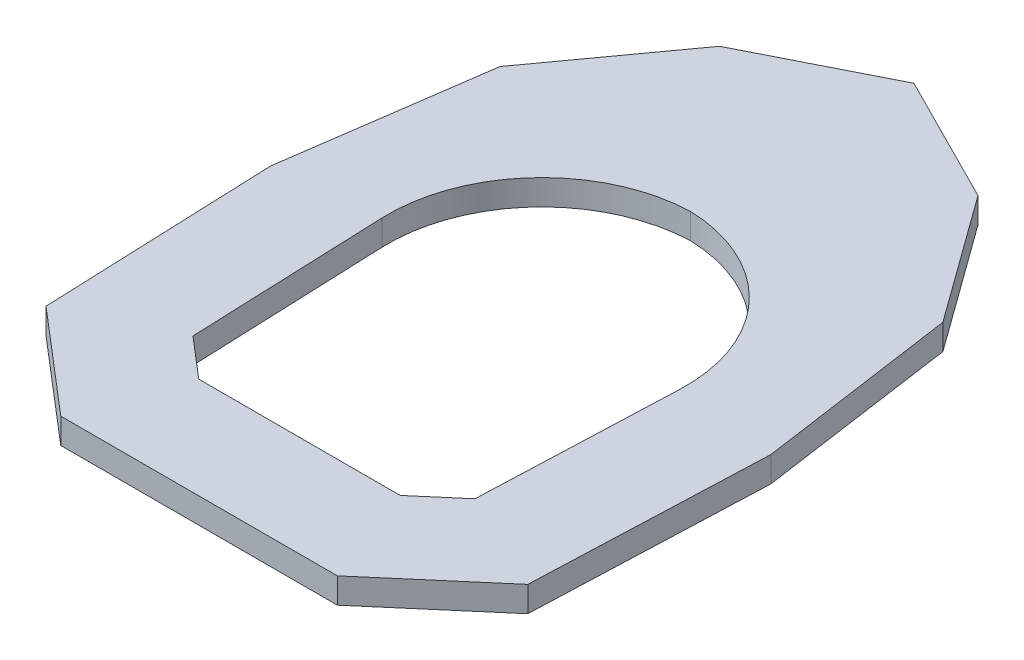
ISO-10303-21;
HEADER;
FILE_DESCRIPTION(('STEP AP214'),'2;1');
FILE_NAME('part.step','',(''),(''),'','','');
FILE_SCHEMA(('AUTOMOTIVE_DESIGN { 1 0 10303 214 1 1 1 1 }'));
ENDSEC;
DATA;
#1=APPLICATION_CONTEXT('core data for automotive mechanical design processes');
#2=APPLICATION_PROTOCOL_DEFINITION('international standard','automotive_design',2000,#1);
#3=PRODUCT_CONTEXT('',#1,'mechanical');
#4=PRODUCT('Part','Part','',(#3));
#5=PRODUCT_RELATED_PRODUCT_CATEGORY('part','',(#4));
#6=PRODUCT_DEFINITION_FORMATION('','',#4);
#7=PRODUCT_DEFINITION_CONTEXT('part definition',#1,'design');
#8=PRODUCT_DEFINITION('design','',#6,#7);
#9=PRODUCT_DEFINITION_SHAPE('','',#8);
#10=(LENGTH_UNIT() NAMED_UNIT(*) SI_UNIT(.MILLI.,.METRE.));
#11=(NAMED_UNIT(*) PLANE_ANGLE_UNIT() SI_UNIT($,.RADIAN.));
#12=(NAMED_UNIT(*) SI_UNIT($,.STERADIAN.) SOLID_ANGLE_UNIT());
#13=UNCERTAINTY_MEASURE_WITH_UNIT(LENGTH_MEASURE(1.E-05),#10,'distance_accuracy_value','');
#14=(GEOMETRIC_REPRESENTATION_CONTEXT(3) GLOBAL_UNCERTAINTY_ASSIGNED_CONTEXT((#13)) GLOBAL_UNIT_ASSIGNED_CONTEXT((#10,
#11,#12)) REPRESENTATION_CONTEXT('',''));
#15=CARTESIAN_POINT('',(0.,0.,0.));
#16=DIRECTION('',(0.,0.,1.));
#17=DIRECTION('',(1.,0.,0.));
#18=AXIS2_PLACEMENT_3D('',#15,#16,#17);
#19=CARTESIAN_POINT('',(9.9772531070188,-50.,31.4077449235651));
#20=DIRECTION('',(0.,1.,0.));
#21=DIRECTION('',(0.,0.,1.));
#22=AXIS2_PLACEMENT_3D('',#19,#20,#21);
#23=CYLINDRICAL_SURFACE('',#22,302.631122632561);
#24=CARTESIAN_POINT('',(9.9772531070188,0.,31.4077449235651));
#25=DIRECTION('',(0.,1.,0.));
#26=DIRECTION('',(0.,0.,1.));
#27=AXIS2_PLACEMENT_3D('',#24,#25,#26);
#28=CIRCLE('',#27,302.631122632561);
#29=CARTESIAN_POINT('',(-8.81239525796218E-13,0.,-271.058866136702));
#30=VERTEX_POINT('',#29);
#31=CARTESIAN_POINT('',(-292.423977969538,0.,43.2014648298256));
#32=VERTEX_POINT('',#31);
#33=EDGE_CURVE('E249',#30,#32,#28,.T.);
#34=ORIENTED_EDGE('',*,*,#33,.T.);
#35=DIRECTION('',(0.,1.,0.));
#36=VECTOR('',#35,1.);
#37=CARTESIAN_POINT('',(-292.423977969538,-50.,43.2014648298256));
#38=LINE('',#37,#36);
#39=CARTESIAN_POINT('',(-292.423977969538,-50.,43.2014648298256));
#40=VERTEX_POINT('',#39);
#41=EDGE_CURVE('E11',#40,#32,#38,.T.);
#42=ORIENTED_EDGE('',*,*,#41,.F.);
#43=CARTESIAN_POINT('',(9.9772531070188,-50.,31.4077449235651));
#44=DIRECTION('',(0.,1.,0.));
#45=DIRECTION('',(0.,0.,1.));
#46=AXIS2_PLACEMENT_3D('',#43,#44,#45);
#47=CIRCLE('',#46,302.631122632561);
#48=CARTESIAN_POINT('',(-8.81239525796218E-13,-50.,-271.058866136702));
#49=VERTEX_POINT('',#48);
#50=EDGE_CURVE('E65',#49,#40,#47,.T.);
#51=ORIENTED_EDGE('',*,*,#50,.F.);
#52=DIRECTION('',(0.,1.,0.));
#53=VECTOR('',#52,1.);
#54=CARTESIAN_POINT('',(-8.81239525796218E-13,-50.,-271.058866136702));
#55=LINE('',#54,#53);
#56=EDGE_CURVE('E284',#49,#30,#55,.T.);
#57=ORIENTED_EDGE('',*,*,#56,.T.);
#58=EDGE_LOOP('',(#34,#42,#51,#57));
#59=FACE_BOUND('',#58,.T.);
#60=ADVANCED_FACE('F45',(#59),#23,.F.);
#61=CARTESIAN_POINT('',(-293.662179747709,-50.,11.4528948267728));
#62=DIRECTION('',(0.999240357191274,0.,-0.0389706114945085));
#63=DIRECTION('',(-0.0389706114945085,0.,-0.999240357191274));
#64=AXIS2_PLACEMENT_3D('',#61,#62,#63);
#65=PLANE('',#64);
#66=DIRECTION('',(-0.0389706114945085,0.,-0.999240357191274));
#67=VECTOR('',#66,1.);
#68=CARTESIAN_POINT('',(-293.662179747709,0.,11.4528948267728));
#69=LINE('',#68,#67);
#70=CARTESIAN_POINT('',(-277.326571574198,0.,430.312089492883));
#71=VERTEX_POINT('',#70);
#72=EDGE_CURVE('E268',#71,#32,#69,.T.);
#73=ORIENTED_EDGE('',*,*,#72,.F.);
#74=DIRECTION('',(0.,1.,0.));
#75=VECTOR('',#74,1.);
#76=CARTESIAN_POINT('',(-277.326571574198,-50.,430.312089492883));
#77=LINE('',#76,#75);
#78=CARTESIAN_POINT('',(-277.326571574198,-50.,430.312089492883));
#79=VERTEX_POINT('',#78);
#80=EDGE_CURVE('E56',#79,#71,#77,.T.);
#81=ORIENTED_EDGE('',*,*,#80,.F.);
#82=DIRECTION('',(-0.0389706114945085,0.,-0.999240357191274));
#83=VECTOR('',#82,1.);
#84=CARTESIAN_POINT('',(-293.662179747709,-50.,11.4528948267728));
#85=LINE('',#84,#83);
#86=EDGE_CURVE('E194',#79,#40,#85,.T.);
#87=ORIENTED_EDGE('',*,*,#86,.T.);
#88=ORIENTED_EDGE('',*,*,#41,.T.);
#89=EDGE_LOOP('',(#73,#81,#87,#88));
#90=FACE_BOUND('',#89,.T.);
#91=ADVANCED_FACE('F392',(#90),#65,.T.);
#92=CARTESIAN_POINT('',(-329.839629485281,-50.,385.365433519217));
#93=DIRECTION('',(0.65025298021813,0.,-0.75971775135075));
#94=DIRECTION('',(-0.75971775135075,0.,-0.65025298021813));
#95=AXIS2_PLACEMENT_3D('',#92,#93,#94);
#96=PLANE('',#95);
#97=DIRECTION('',(-0.75971775135075,0.,-0.65025298021813));
#98=VECTOR('',#97,1.);
#99=CARTESIAN_POINT('',(-329.839629485281,0.,385.365433519217));
#100=LINE('',#99,#98);
#101=CARTESIAN_POINT('',(-198.047881984539,0.,498.167821548384));
#102=VERTEX_POINT('',#101);
#103=EDGE_CURVE('E183',#102,#71,#100,.T.);
#104=ORIENTED_EDGE('',*,*,#103,.F.);
#105=DIRECTION('',(0.,1.,0.));
#106=VECTOR('',#105,1.);
#107=CARTESIAN_POINT('',(-198.047881984539,-50.,498.167821548384));
#108=LINE('',#107,#106);
#109=CARTESIAN_POINT('',(-198.047881984539,-50.,498.167821548384));
#110=VERTEX_POINT('',#109);
#111=EDGE_CURVE('E179',#110,#102,#108,.T.);
#112=ORIENTED_EDGE('',*,*,#111,.F.);
#113=DIRECTION('',(-0.75971775135075,0.,-0.65025298021813));
#114=VECTOR('',#113,1.);
#115=CARTESIAN_POINT('',(-329.839629485281,-50.,385.365433519217));
#116=LINE('',#115,#114);
#117=EDGE_CURVE('E182',#110,#79,#116,.T.);
#118=ORIENTED_EDGE('',*,*,#117,.T.);
#119=ORIENTED_EDGE('',*,*,#80,.T.);
#120=EDGE_LOOP('',(#104,#112,#118,#119));
#121=FACE_BOUND('',#120,.T.);
#122=ADVANCED_FACE('F181',(#121),#96,.T.);
#123=CARTESIAN_POINT('',(5.58528957813897E-13,-50.,498.167821548383));
#124=DIRECTION('',(0.,0.,-1.));
#125=DIRECTION('',(-1.,0.,0.));
#126=AXIS2_PLACEMENT_3D('',#123,#124,#125);
#127=PLANE('',#126);
#128=DIRECTION('',(-1.,0.,0.));
#129=VECTOR('',#128,1.);
#130=CARTESIAN_POINT('',(5.58528957813897E-13,0.,498.167821548383));
#131=LINE('',#130,#129);
#132=CARTESIAN_POINT('',(198.04788198454,0.,498.167821548383));
#133=VERTEX_POINT('',#132);
#134=EDGE_CURVE('E263',#133,#102,#131,.T.);
#135=ORIENTED_EDGE('',*,*,#134,.F.);
#136=DIRECTION('',(0.,1.,0.));
#137=VECTOR('',#136,1.);
#138=CARTESIAN_POINT('',(198.04788198454,-50.,498.167821548383));
#139=LINE('',#138,#137);
#140=CARTESIAN_POINT('',(198.04788198454,-50.,498.167821548383));
#141=VERTEX_POINT('',#140);
#142=EDGE_CURVE('E189',#141,#133,#139,.T.);
#143=ORIENTED_EDGE('',*,*,#142,.F.);
#144=DIRECTION('',(-1.,0.,0.));
#145=VECTOR('',#144,1.);
#146=CARTESIAN_POINT('',(5.58528957813897E-13,-50.,498.167821548383));
#147=LINE('',#146,#145);
#148=EDGE_CURVE('E193',#141,#110,#147,.T.);
#149=ORIENTED_EDGE('',*,*,#148,.T.);
#150=ORIENTED_EDGE('',*,*,#111,.T.);
#151=EDGE_LOOP('',(#135,#143,#149,#150));
#152=FACE_BOUND('',#151,.T.);
#153=ADVANCED_FACE('F197',(#152),#127,.T.);
#154=CARTESIAN_POINT('',(329.839629485283,-50.,385.365433519216));
#155=DIRECTION('',(0.650252980218133,0.,0.759717751350748));
#156=DIRECTION('',(0.759717751350748,0.,-0.650252980218133));
#157=AXIS2_PLACEMENT_3D('',#154,#155,#156);
#158=PLANE('',#157);
#159=DIRECTION('',(0.759717751350748,0.,-0.650252980218133));
#160=VECTOR('',#159,1.);
#161=CARTESIAN_POINT('',(329.839629485283,0.,385.365433519216));
#162=LINE('',#161,#160);
#163=CARTESIAN_POINT('',(277.326571574199,0.,430.312089492882));
#164=VERTEX_POINT('',#163);
#165=EDGE_CURVE('E260',#133,#164,#162,.T.);
#166=ORIENTED_EDGE('',*,*,#165,.T.);
#167=DIRECTION('',(0.,1.,0.));
#168=VECTOR('',#167,1.);
#169=CARTESIAN_POINT('',(277.326571574199,-50.,430.312089492882));
#170=LINE('',#169,#168);
#171=CARTESIAN_POINT('',(277.326571574199,-50.,430.312089492882));
#172=VERTEX_POINT('',#171);
#173=EDGE_CURVE('E277',#172,#164,#170,.T.);
#174=ORIENTED_EDGE('',*,*,#173,.F.);
#175=DIRECTION('',(0.759717751350748,0.,-0.650252980218133));
#176=VECTOR('',#175,1.);
#177=CARTESIAN_POINT('',(329.839629485283,-50.,385.365433519216));
#178=LINE('',#177,#176);
#179=EDGE_CURVE('E200',#141,#172,#178,.T.);
#180=ORIENTED_EDGE('',*,*,#179,.F.);
#181=ORIENTED_EDGE('',*,*,#142,.T.);
#182=EDGE_LOOP('',(#166,#174,#180,#181));
#183=FACE_BOUND('',#182,.T.);
#184=ADVANCED_FACE('F395',(#183),#158,.F.);
#185=CARTESIAN_POINT('',(293.662179747709,-50.,11.452894826772));
#186=DIRECTION('',(0.999240357191274,0.,0.0389706114945061));
#187=DIRECTION('',(0.0389706114945061,0.,-0.999240357191274));
#188=AXIS2_PLACEMENT_3D('',#185,#186,#187);
#189=PLANE('',#188);
#190=DIRECTION('',(0.0389706114945061,0.,-0.999240357191274));
#191=VECTOR('',#190,1.);
#192=CARTESIAN_POINT('',(293.662179747709,0.,11.452894826772));
#193=LINE('',#192,#191);
#194=CARTESIAN_POINT('',(292.423977969537,0.,43.2014648298249));
#195=VERTEX_POINT('',#194);
#196=EDGE_CURVE('E256',#164,#195,#193,.T.);
#197=ORIENTED_EDGE('',*,*,#196,.T.);
#198=DIRECTION('',(0.,1.,0.));
#199=VECTOR('',#198,1.);
#200=CARTESIAN_POINT('',(292.423977969537,-50.,43.2014648298249));
#201=LINE('',#200,#199);
#202=CARTESIAN_POINT('',(292.423977969537,-50.,43.2014648298249));
#203=VERTEX_POINT('',#202);
#204=EDGE_CURVE('E281',#203,#195,#201,.T.);
#205=ORIENTED_EDGE('',*,*,#204,.F.);
#206=DIRECTION('',(0.0389706114945061,0.,-0.999240357191274));
#207=VECTOR('',#206,1.);
#208=CARTESIAN_POINT('',(293.662179747709,-50.,11.452894826772));
#209=LINE('',#208,#207);
#210=EDGE_CURVE('E203',#172,#203,#209,.T.);
#211=ORIENTED_EDGE('',*,*,#210,.F.);
#212=ORIENTED_EDGE('',*,*,#173,.T.);
#213=EDGE_LOOP('',(#197,#205,#211,#212));
#214=FACE_BOUND('',#213,.T.);
#215=ADVANCED_FACE('F385',(#214),#189,.F.);
#216=CARTESIAN_POINT('',(-441.846790113478,-50.,-319.981845912736));
#217=DIRECTION('',(-0.809921374663058,0.,-0.586538461538459));
#218=DIRECTION('',(-0.586538461538459,0.,0.809921374663058));
#219=AXIS2_PLACEMENT_3D('',#216,#217,#218);
#220=PLANE('',#219);
#221=DIRECTION('',(-0.586538461538459,0.,0.809921374663058));
#222=VECTOR('',#221,1.);
#223=CARTESIAN_POINT('',(-441.846790113478,0.,-319.981845912736));
#224=LINE('',#223,#222);
#225=CARTESIAN_POINT('',(-252.944628181074,0.,-580.827312496149));
#226=VERTEX_POINT('',#225);
#227=CARTESIAN_POINT('',(-434.221233960033,0.,-330.511591747595));
#228=VERTEX_POINT('',#227);
#229=EDGE_CURVE('E209',#226,#228,#224,.T.);
#230=ORIENTED_EDGE('',*,*,#229,.F.);
#231=DIRECTION('',(0.,1.,0.));
#232=VECTOR('',#231,1.);
#233=CARTESIAN_POINT('',(-252.944628181074,-50.,-580.827312496149));
#234=LINE('',#233,#232);
#235=CARTESIAN_POINT('',(-252.944628181074,-50.,-580.827312496149));
#236=VERTEX_POINT('',#235);
#237=EDGE_CURVE('E287',#236,#226,#234,.T.);
#238=ORIENTED_EDGE('',*,*,#237,.F.);
#239=DIRECTION('',(-0.586538461538459,0.,0.809921374663058));
#240=VECTOR('',#239,1.);
#241=CARTESIAN_POINT('',(-441.846790113478,-50.,-319.981845912736));
#242=LINE('',#241,#240);
#243=CARTESIAN_POINT('',(-434.221233960033,-50.,-330.511591747595));
#244=VERTEX_POINT('',#243);
#245=EDGE_CURVE('E271',#236,#244,#242,.T.);
#246=ORIENTED_EDGE('',*,*,#245,.T.);
#247=DIRECTION('',(0.,1.,0.));
#248=VECTOR('',#247,1.);
#249=CARTESIAN_POINT('',(-434.221233960033,-50.,-330.511591747595));
#250=LINE('',#249,#248);
#251=EDGE_CURVE('E49',#244,#228,#250,.T.);
#252=ORIENTED_EDGE('',*,*,#251,.T.);
#253=EDGE_LOOP('',(#230,#238,#246,#252));
#254=FACE_BOUND('',#253,.T.);
#255=ADVANCED_FACE('F47',(#254),#220,.T.);
#256=CARTESIAN_POINT('',(-284.843162384152,-50.,-564.738304024302));
#257=DIRECTION('',(-0.450340007604234,0.,-0.892857142857142));
#258=DIRECTION('',(-0.892857142857142,0.,0.450340007604234));
#259=AXIS2_PLACEMENT_3D('',#256,#257,#258);
#260=PLANE('',#259);
#261=DIRECTION('',(-0.892857142857142,0.,0.450340007604234));
#262=VECTOR('',#261,1.);
#263=CARTESIAN_POINT('',(-284.843162384152,0.,-564.738304024302));
#264=LINE('',#263,#262);
#265=CARTESIAN_POINT('',(1.29112639441303,0.,-709.058947942798));
#266=VERTEX_POINT('',#265);
#267=EDGE_CURVE('E245',#266,#226,#264,.T.);
#268=ORIENTED_EDGE('',*,*,#267,.F.);
#269=DIRECTION('',(0.,1.,0.));
#270=VECTOR('',#269,1.);
#271=CARTESIAN_POINT('',(1.29112639441303,-50.,-709.058947942798));
#272=LINE('',#271,#270);
#273=CARTESIAN_POINT('',(1.29112639441303,-50.,-709.058947942798));
#274=VERTEX_POINT('',#273);
#275=EDGE_CURVE('E290',#274,#266,#272,.T.);
#276=ORIENTED_EDGE('',*,*,#275,.F.);
#277=DIRECTION('',(-0.892857142857142,0.,0.450340007604234));
#278=VECTOR('',#277,1.);
#279=CARTESIAN_POINT('',(-284.843162384152,-50.,-564.738304024302));
#280=LINE('',#279,#278);
#281=EDGE_CURVE('E337',#274,#236,#280,.T.);
#282=ORIENTED_EDGE('',*,*,#281,.T.);
#283=ORIENTED_EDGE('',*,*,#237,.T.);
#284=EDGE_LOOP('',(#268,#276,#282,#283));
#285=FACE_BOUND('',#284,.T.);
#286=ADVANCED_FACE('F333',(#285),#260,.T.);
#287=CARTESIAN_POINT('',(285.366859059435,-50.,-565.776600221229));
#288=DIRECTION('',(-0.450340007604231,0.,0.892857142857143));
#289=DIRECTION('',(0.892857142857143,0.,0.450340007604231));
#290=AXIS2_PLACEMENT_3D('',#287,#288,#289);
#291=PLANE('',#290);
#292=DIRECTION('',(0.892857142857143,0.,0.450340007604231));
#293=VECTOR('',#292,1.);
#294=CARTESIAN_POINT('',(285.366859059435,0.,-565.776600221229));
#295=LINE('',#294,#293);
#296=CARTESIAN_POINT('',(255.5268809699,0.,-580.82731249615));
#297=VERTEX_POINT('',#296);
#298=EDGE_CURVE('E242',#266,#297,#295,.T.);
#299=ORIENTED_EDGE('',*,*,#298,.T.);
#300=DIRECTION('',(0.,1.,0.));
#301=VECTOR('',#300,1.);
#302=CARTESIAN_POINT('',(255.5268809699,-50.,-580.82731249615));
#303=LINE('',#302,#301);
#304=CARTESIAN_POINT('',(255.5268809699,-50.,-580.82731249615));
#305=VERTEX_POINT('',#304);
#306=EDGE_CURVE('E293',#305,#297,#303,.T.);
#307=ORIENTED_EDGE('',*,*,#306,.F.);
#308=DIRECTION('',(0.892857142857143,0.,0.450340007604231));
#309=VECTOR('',#308,1.);
#310=CARTESIAN_POINT('',(285.366859059435,-50.,-565.776600221229));
#311=LINE('',#310,#309);
#312=EDGE_CURVE('E370',#274,#305,#311,.T.);
#313=ORIENTED_EDGE('',*,*,#312,.F.);
#314=ORIENTED_EDGE('',*,*,#275,.T.);
#315=EDGE_LOOP('',(#299,#307,#313,#314));
#316=FACE_BOUND('',#315,.T.);
#317=ADVANCED_FACE('F414',(#316),#291,.F.);
#318=CARTESIAN_POINT('',(443.540677274788,-50.,-321.208545195773));
#319=DIRECTION('',(-0.809921374663057,0.,0.586538461538461));
#320=DIRECTION('',(0.586538461538461,0.,0.809921374663057));
#321=AXIS2_PLACEMENT_3D('',#318,#319,#320);
#322=PLANE('',#321);
#323=DIRECTION('',(0.586538461538461,0.,0.809921374663057));
#324=VECTOR('',#323,1.);
#325=CARTESIAN_POINT('',(443.540677274788,0.,-321.208545195773));
#326=LINE('',#325,#324);
#327=CARTESIAN_POINT('',(436.80348674886,0.,-330.511591747596));
#328=VERTEX_POINT('',#327);
#329=EDGE_CURVE('E239',#297,#328,#326,.T.);
#330=ORIENTED_EDGE('',*,*,#329,.T.);
#331=DIRECTION('',(0.,1.,0.));
#332=VECTOR('',#331,1.);
#333=CARTESIAN_POINT('',(436.80348674886,-50.,-330.511591747596));
#334=LINE('',#333,#332);
#335=CARTESIAN_POINT('',(436.80348674886,-50.,-330.511591747596));
#336=VERTEX_POINT('',#335);
#337=EDGE_CURVE('E297',#336,#328,#334,.T.);
#338=ORIENTED_EDGE('',*,*,#337,.F.);
#339=DIRECTION('',(0.586538461538461,0.,0.809921374663057));
#340=VECTOR('',#339,1.);
#341=CARTESIAN_POINT('',(443.540677274788,-50.,-321.208545195773));
#342=LINE('',#341,#340);
#343=EDGE_CURVE('E367',#305,#336,#342,.T.);
#344=ORIENTED_EDGE('',*,*,#343,.F.);
#345=ORIENTED_EDGE('',*,*,#306,.T.);
#346=EDGE_LOOP('',(#330,#338,#344,#345));
#347=FACE_BOUND('',#346,.T.);
#348=ADVANCED_FACE('F417',(#347),#322,.F.);
#349=CARTESIAN_POINT('',(474.245998064971,-50.,-67.5188176070536));
#350=DIRECTION('',(-0.990016779137899,0.,0.140949554896142));
#351=DIRECTION('',(0.140949554896142,0.,0.990016779137899));
#352=AXIS2_PLACEMENT_3D('',#349,#350,#351);
#353=PLANE('',#352);
#354=DIRECTION('',(0.140949554896142,0.,0.990016779137899));
#355=VECTOR('',#354,1.);
#356=CARTESIAN_POINT('',(474.245998064971,0.,-67.5188176070536));
#357=LINE('',#356,#355);
#358=CARTESIAN_POINT('',(492.998077488034,0.,64.1940727687835));
#359=VERTEX_POINT('',#358);
#360=EDGE_CURVE('E236',#328,#359,#357,.T.);
#361=ORIENTED_EDGE('',*,*,#360,.T.);
#362=DIRECTION('',(0.,1.,0.));
#363=VECTOR('',#362,1.);
#364=CARTESIAN_POINT('',(492.998077488034,-50.,64.1940727687835));
#365=LINE('',#364,#363);
#366=CARTESIAN_POINT('',(492.998077488034,-50.,64.1940727687835));
#367=VERTEX_POINT('',#366);
#368=EDGE_CURVE('E301',#367,#359,#365,.T.);
#369=ORIENTED_EDGE('',*,*,#368,.F.);
#370=DIRECTION('',(0.140949554896142,0.,0.990016779137899));
#371=VECTOR('',#370,1.);
#372=CARTESIAN_POINT('',(474.245998064971,-50.,-67.5188176070536));
#373=LINE('',#372,#371);
#374=EDGE_CURVE('E364',#336,#367,#373,.T.);
#375=ORIENTED_EDGE('',*,*,#374,.F.);
#376=ORIENTED_EDGE('',*,*,#337,.T.);
#377=EDGE_LOOP('',(#361,#369,#375,#376));
#378=FACE_BOUND('',#377,.T.);
#379=ADVANCED_FACE('F421',(#378),#353,.F.);
#380=CARTESIAN_POINT('',(494.749138972739,-50.,19.2953340438966));
#381=DIRECTION('',(-0.999240357191274,0.,-0.0389706114945063));
#382=DIRECTION('',(-0.0389706114945063,0.,0.999240357191274));
#383=AXIS2_PLACEMENT_3D('',#380,#381,#382);
#384=PLANE('',#383);
#385=DIRECTION('',(-0.0389706114945063,0.,0.999240357191274));
#386=VECTOR('',#385,1.);
#387=CARTESIAN_POINT('',(494.749138972739,0.,19.2953340438966));
#388=LINE('',#387,#386);
#389=CARTESIAN_POINT('',(475.060122819992,0.,524.138824528762));
#390=VERTEX_POINT('',#389);
#391=EDGE_CURVE('E233',#359,#390,#388,.T.);
#392=ORIENTED_EDGE('',*,*,#391,.T.);
#393=DIRECTION('',(0.,1.,0.));
#394=VECTOR('',#393,1.);
#395=CARTESIAN_POINT('',(475.060122819992,-50.,524.138824528762));
#396=LINE('',#395,#394);
#397=CARTESIAN_POINT('',(475.060122819992,-50.,524.138824528762));
#398=VERTEX_POINT('',#397);
#399=EDGE_CURVE('E305',#398,#390,#396,.T.);
#400=ORIENTED_EDGE('',*,*,#399,.F.);
#401=DIRECTION('',(-0.0389706114945063,0.,0.999240357191274));
#402=VECTOR('',#401,1.);
#403=CARTESIAN_POINT('',(494.749138972739,-50.,19.2953340438966));
#404=LINE('',#403,#402);
#405=EDGE_CURVE('E361',#367,#398,#404,.T.);
#406=ORIENTED_EDGE('',*,*,#405,.F.);
#407=ORIENTED_EDGE('',*,*,#368,.T.);
#408=EDGE_LOOP('',(#392,#400,#406,#407));
#409=FACE_BOUND('',#408,.T.);
#410=ADVANCED_FACE('F425',(#409),#384,.F.);
#411=CARTESIAN_POINT('',(459.798323418568,-50.,537.20161071037));
#412=DIRECTION('',(-0.650252980218132,0.,-0.759717751350748));
#413=DIRECTION('',(-0.759717751350748,0.,0.650252980218132));
#414=AXIS2_PLACEMENT_3D('',#411,#412,#413);
#415=PLANE('',#414);
#416=DIRECTION('',(-0.759717751350749,0.,0.650252980218132));
#417=VECTOR('',#416,1.);
#418=CARTESIAN_POINT('',(459.798323418568,0.,537.20161071037));
#419=LINE('',#418,#417);
#420=CARTESIAN_POINT('',(273.243244409874,0.,696.87669515397));
#421=VERTEX_POINT('',#420);
#422=EDGE_CURVE('E229',#390,#421,#419,.T.);
#423=ORIENTED_EDGE('',*,*,#422,.T.);
#424=DIRECTION('',(0.,1.,0.));
#425=VECTOR('',#424,1.);
#426=CARTESIAN_POINT('',(273.243244409874,-50.,696.87669515397));
#427=LINE('',#426,#425);
#428=CARTESIAN_POINT('',(273.243244409874,-50.,696.87669515397));
#429=VERTEX_POINT('',#428);
#430=EDGE_CURVE('E309',#429,#421,#427,.T.);
#431=ORIENTED_EDGE('',*,*,#430,.F.);
#432=DIRECTION('',(-0.759717751350749,0.,0.650252980218132));
#433=VECTOR('',#432,1.);
#434=CARTESIAN_POINT('',(459.798323418568,-50.,537.20161071037));
#435=LINE('',#434,#433);
#436=EDGE_CURVE('E358',#398,#429,#435,.T.);
#437=ORIENTED_EDGE('',*,*,#436,.F.);
#438=ORIENTED_EDGE('',*,*,#399,.T.);
#439=EDGE_LOOP('',(#423,#431,#437,#438));
#440=FACE_BOUND('',#439,.T.);
#441=ADVANCED_FACE('F429',(#440),#415,.F.);
#442=CARTESIAN_POINT('',(0.,-50.,696.87669515397));
#443=DIRECTION('',(0.,0.,1.));
#444=DIRECTION('',(1.,0.,0.));
#445=AXIS2_PLACEMENT_3D('',#442,#443,#444);
#446=PLANE('',#445);
#447=DIRECTION('',(1.,0.,0.));
#448=VECTOR('',#447,1.);
#449=CARTESIAN_POINT('',(0.,0.,696.87669515397));
#450=LINE('',#449,#448);
#451=CARTESIAN_POINT('',(-270.660991621045,0.,696.87669515397));
#452=VERTEX_POINT('',#451);
#453=EDGE_CURVE('E225',#452,#421,#450,.T.);
#454=ORIENTED_EDGE('',*,*,#453,.F.);
#455=DIRECTION('',(0.,1.,0.));
#456=VECTOR('',#455,1.);
#457=CARTESIAN_POINT('',(-270.660991621045,-50.,696.87669515397));
#458=LINE('',#457,#456);
#459=CARTESIAN_POINT('',(-270.660991621045,-50.,696.87669515397));
#460=VERTEX_POINT('',#459);
#461=EDGE_CURVE('E312',#460,#452,#458,.T.);
#462=ORIENTED_EDGE('',*,*,#461,.F.);
#463=DIRECTION('',(1.,0.,0.));
#464=VECTOR('',#463,1.);
#465=CARTESIAN_POINT('',(0.,-50.,696.87669515397));
#466=LINE('',#465,#464);
#467=EDGE_CURVE('E354',#460,#429,#466,.T.);
#468=ORIENTED_EDGE('',*,*,#467,.T.);
#469=ORIENTED_EDGE('',*,*,#430,.T.);
#470=EDGE_LOOP('',(#454,#462,#468,#469));
#471=FACE_BOUND('',#470,.T.);
#472=ADVANCED_FACE('F433',(#471),#446,.T.);
#473=CARTESIAN_POINT('',(-458.706472213489,-50.,535.925955284613));
#474=DIRECTION('',(-0.65025298021813,0.,0.75971775135075));
#475=DIRECTION('',(0.75971775135075,0.,0.65025298021813));
#476=AXIS2_PLACEMENT_3D('',#473,#474,#475);
#477=PLANE('',#476);
#478=DIRECTION('',(0.75971775135075,0.,0.65025298021813));
#479=VECTOR('',#478,1.);
#480=CARTESIAN_POINT('',(-458.706472213489,0.,535.925955284613));
#481=LINE('',#480,#479);
#482=CARTESIAN_POINT('',(-472.477870031163,0.,524.138824528762));
#483=VERTEX_POINT('',#482);
#484=EDGE_CURVE('E221',#483,#452,#481,.T.);
#485=ORIENTED_EDGE('',*,*,#484,.F.);
#486=DIRECTION('',(0.,1.,0.));
#487=VECTOR('',#486,1.);
#488=CARTESIAN_POINT('',(-472.477870031163,-50.,524.138824528762));
#489=LINE('',#488,#487);
#490=CARTESIAN_POINT('',(-472.477870031163,-50.,524.138824528762));
#491=VERTEX_POINT('',#490);
#492=EDGE_CURVE('E315',#491,#483,#489,.T.);
#493=ORIENTED_EDGE('',*,*,#492,.F.);
#494=DIRECTION('',(0.75971775135075,0.,0.65025298021813));
#495=VECTOR('',#494,1.);
#496=CARTESIAN_POINT('',(-458.706472213489,-50.,535.925955284613));
#497=LINE('',#496,#495);
#498=EDGE_CURVE('E350',#491,#460,#497,.T.);
#499=ORIENTED_EDGE('',*,*,#498,.T.);
#500=ORIENTED_EDGE('',*,*,#461,.T.);
#501=EDGE_LOOP('',(#485,#493,#499,#500));
#502=FACE_BOUND('',#501,.T.);
#503=ADVANCED_FACE('F437',(#502),#477,.T.);
#504=CARTESIAN_POINT('',(-492.170807873327,-50.,19.1947785180361));
#505=DIRECTION('',(-0.999240357191274,0.,0.0389706114945084));
#506=DIRECTION('',(0.0389706114945084,0.,0.999240357191274));
#507=AXIS2_PLACEMENT_3D('',#504,#505,#506);
#508=PLANE('',#507);
#509=DIRECTION('',(0.0389706114945084,0.,0.999240357191274));
#510=VECTOR('',#509,1.);
#511=CARTESIAN_POINT('',(-492.170807873327,0.,19.1947785180361));
#512=LINE('',#511,#510);
#513=CARTESIAN_POINT('',(-490.415824699206,0.,64.1940727687848));
#514=VERTEX_POINT('',#513);
#515=EDGE_CURVE('E217',#514,#483,#512,.T.);
#516=ORIENTED_EDGE('',*,*,#515,.F.);
#517=DIRECTION('',(0.,1.,0.));
#518=VECTOR('',#517,1.);
#519=CARTESIAN_POINT('',(-490.415824699206,-50.,64.1940727687848));
#520=LINE('',#519,#518);
#521=CARTESIAN_POINT('',(-490.415824699206,-50.,64.1940727687848));
#522=VERTEX_POINT('',#521);
#523=EDGE_CURVE('E317',#522,#514,#520,.T.);
#524=ORIENTED_EDGE('',*,*,#523,.F.);
#525=DIRECTION('',(0.0389706114945084,0.,0.999240357191274));
#526=VECTOR('',#525,1.);
#527=CARTESIAN_POINT('',(-492.170807873327,-50.,19.1947785180361));
#528=LINE('',#527,#526);
#529=EDGE_CURVE('E344',#522,#491,#528,.T.);
#530=ORIENTED_EDGE('',*,*,#529,.T.);
#531=ORIENTED_EDGE('',*,*,#492,.T.);
#532=EDGE_LOOP('',(#516,#524,#530,#531));
#533=FACE_BOUND('',#532,.T.);
#534=ADVANCED_FACE('F441',(#533),#508,.T.);
#535=CARTESIAN_POINT('',(-471.715046316523,-50.,-67.1584837925909));
#536=DIRECTION('',(-0.990016779137899,0.,-0.140949554896139));
#537=DIRECTION('',(-0.140949554896139,0.,0.990016779137899));
#538=AXIS2_PLACEMENT_3D('',#535,#536,#537);
#539=PLANE('',#538);
#540=DIRECTION('',(-0.140949554896139,0.,0.990016779137899));
#541=VECTOR('',#540,1.);
#542=CARTESIAN_POINT('',(-471.715046316523,0.,-67.1584837925909));
#543=LINE('',#542,#541);
#544=EDGE_CURVE('E213',#228,#514,#543,.T.);
#545=ORIENTED_EDGE('',*,*,#544,.F.);
#546=ORIENTED_EDGE('',*,*,#251,.F.);
#547=DIRECTION('',(-0.140949554896139,0.,0.990016779137899));
#548=VECTOR('',#547,1.);
#549=CARTESIAN_POINT('',(-471.715046316523,-50.,-67.1584837925909));
#550=LINE('',#549,#548);
#551=EDGE_CURVE('E340',#244,#522,#550,.T.);
#552=ORIENTED_EDGE('',*,*,#551,.T.);
#553=ORIENTED_EDGE('',*,*,#523,.T.);
#554=EDGE_LOOP('',(#545,#546,#552,#553));
#555=FACE_BOUND('',#554,.T.);
#556=ADVANCED_FACE('F325',(#555),#539,.T.);
#557=CARTESIAN_POINT('',(-9.97725310701902,-50.,31.4077449235651));
#558=DIRECTION('',(0.,1.,0.));
#559=DIRECTION('',(0.,0.,1.));
#560=AXIS2_PLACEMENT_3D('',#557,#558,#559);
#561=CYLINDRICAL_SURFACE('',#560,302.631122632561);
#562=CARTESIAN_POINT('',(-9.97725310701902,0.,31.4077449235651));
#563=DIRECTION('',(0.,1.,0.));
#564=DIRECTION('',(0.,0.,1.));
#565=AXIS2_PLACEMENT_3D('',#562,#563,#564);
#566=CIRCLE('',#565,302.631122632561);
#567=EDGE_CURVE('E252',#30,#195,#566,.F.);
#568=ORIENTED_EDGE('',*,*,#567,.F.);
#569=ORIENTED_EDGE('',*,*,#56,.F.);
#570=CARTESIAN_POINT('',(-9.97725310701902,-50.,31.4077449235651));
#571=DIRECTION('',(0.,1.,0.));
#572=DIRECTION('',(0.,0.,1.));
#573=AXIS2_PLACEMENT_3D('',#570,#571,#572);
#574=CIRCLE('',#573,302.631122632561);
#575=EDGE_CURVE('E377',#49,#203,#574,.F.);
#576=ORIENTED_EDGE('',*,*,#575,.T.);
#577=ORIENTED_EDGE('',*,*,#204,.T.);
#578=EDGE_LOOP('',(#568,#569,#576,#577));
#579=FACE_BOUND('',#578,.T.);
#580=ADVANCED_FACE('F389',(#579),#561,.F.);
#581=CARTESIAN_POINT('',(0.,-50.,0.));
#582=DIRECTION('',(0.,1.,0.));
#583=DIRECTION('',(0.,0.,1.));
#584=AXIS2_PLACEMENT_3D('',#581,#582,#583);
#585=PLANE('',#584);
#586=ORIENTED_EDGE('',*,*,#245,.F.);
#587=ORIENTED_EDGE('',*,*,#281,.F.);
#588=ORIENTED_EDGE('',*,*,#312,.T.);
#589=ORIENTED_EDGE('',*,*,#343,.T.);
#590=ORIENTED_EDGE('',*,*,#374,.T.);
#591=ORIENTED_EDGE('',*,*,#405,.T.);
#592=ORIENTED_EDGE('',*,*,#436,.T.);
#593=ORIENTED_EDGE('',*,*,#467,.F.);
#594=ORIENTED_EDGE('',*,*,#498,.F.);
#595=ORIENTED_EDGE('',*,*,#529,.F.);
#596=ORIENTED_EDGE('',*,*,#551,.F.);
#597=EDGE_LOOP('',(#586,#587,#588,#589,#590,#591,#592,#593,#594,#595,#596));
#598=FACE_BOUND('',#597,.T.);
#599=ORIENTED_EDGE('',*,*,#50,.T.);
#600=ORIENTED_EDGE('',*,*,#86,.F.);
#601=ORIENTED_EDGE('',*,*,#117,.F.);
#602=ORIENTED_EDGE('',*,*,#148,.F.);
#603=ORIENTED_EDGE('',*,*,#179,.T.);
#604=ORIENTED_EDGE('',*,*,#210,.T.);
#605=ORIENTED_EDGE('',*,*,#575,.F.);
#606=EDGE_LOOP('',(#599,#600,#601,#602,#603,#604,#605));
#607=FACE_BOUND('',#606,.T.);
#608=ADVANCED_FACE('F192',(#598,#607),#585,.F.);
#609=CARTESIAN_POINT('',(0.,0.,0.));
#610=DIRECTION('',(0.,1.,0.));
#611=DIRECTION('',(0.,0.,1.));
#612=AXIS2_PLACEMENT_3D('',#609,#610,#611);
#613=PLANE('',#612);
#614=ORIENTED_EDGE('',*,*,#229,.T.);
#615=ORIENTED_EDGE('',*,*,#544,.T.);
#616=ORIENTED_EDGE('',*,*,#515,.T.);
#617=ORIENTED_EDGE('',*,*,#484,.T.);
#618=ORIENTED_EDGE('',*,*,#453,.T.);
#619=ORIENTED_EDGE('',*,*,#422,.F.);
#620=ORIENTED_EDGE('',*,*,#391,.F.);
#621=ORIENTED_EDGE('',*,*,#360,.F.);
#622=ORIENTED_EDGE('',*,*,#329,.F.);
#623=ORIENTED_EDGE('',*,*,#298,.F.);
#624=ORIENTED_EDGE('',*,*,#267,.T.);
#625=EDGE_LOOP('',(#614,#615,#616,#617,#618,#619,#620,#621,#622,#623,#624));
#626=FACE_BOUND('',#625,.T.);
#627=ORIENTED_EDGE('',*,*,#33,.F.);
#628=ORIENTED_EDGE('',*,*,#567,.T.);
#629=ORIENTED_EDGE('',*,*,#196,.F.);
#630=ORIENTED_EDGE('',*,*,#165,.F.);
#631=ORIENTED_EDGE('',*,*,#134,.T.);
#632=ORIENTED_EDGE('',*,*,#103,.T.);
#633=ORIENTED_EDGE('',*,*,#72,.T.);
#634=EDGE_LOOP('',(#627,#628,#629,#630,#631,#632,#633));
#635=FACE_BOUND('',#634,.T.);
#636=ADVANCED_FACE('F327',(#626,#635),#613,.T.);
#637=CLOSED_SHELL('',(#60,#91,#122,#153,#184,#215,#255,#286,#317,#348,#379,#410,#441,#472,#503,
#534,#556,#580,#608,#636));
#638=MANIFOLD_SOLID_BREP('B2',#637);
#639=ADVANCED_BREP_SHAPE_REPRESENTATION('',(#18,#638),#14);
#640=SHAPE_DEFINITION_REPRESENTATION(#9,#639);
ENDSEC;
END-ISO-10303-21;
